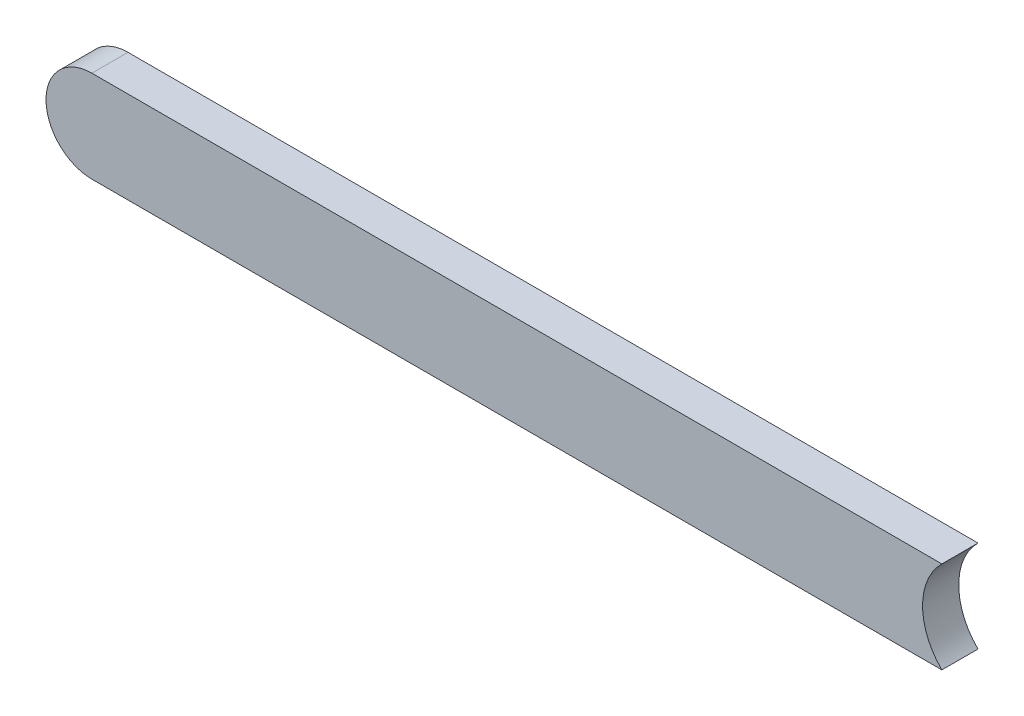
ISO-10303-21;
HEADER;
FILE_DESCRIPTION(('STEP AP214'),'2;1');
FILE_NAME('part.step','',(''),(''),'','','');
FILE_SCHEMA(('AUTOMOTIVE_DESIGN { 1 0 10303 214 1 1 1 1 }'));
ENDSEC;
DATA;
#1=APPLICATION_CONTEXT('core data for automotive mechanical design processes');
#2=APPLICATION_PROTOCOL_DEFINITION('international standard','automotive_design',2000,#1);
#3=PRODUCT_CONTEXT('',#1,'mechanical');
#4=PRODUCT('Part','Part','',(#3));
#5=PRODUCT_RELATED_PRODUCT_CATEGORY('part','',(#4));
#6=PRODUCT_DEFINITION_FORMATION('','',#4);
#7=PRODUCT_DEFINITION_CONTEXT('part definition',#1,'design');
#8=PRODUCT_DEFINITION('design','',#6,#7);
#9=PRODUCT_DEFINITION_SHAPE('','',#8);
#10=(LENGTH_UNIT() NAMED_UNIT(*) SI_UNIT(.MILLI.,.METRE.));
#11=(NAMED_UNIT(*) PLANE_ANGLE_UNIT() SI_UNIT($,.RADIAN.));
#12=(NAMED_UNIT(*) SI_UNIT($,.STERADIAN.) SOLID_ANGLE_UNIT());
#13=UNCERTAINTY_MEASURE_WITH_UNIT(LENGTH_MEASURE(1.E-05),#10,'distance_accuracy_value','');
#14=(GEOMETRIC_REPRESENTATION_CONTEXT(3) GLOBAL_UNCERTAINTY_ASSIGNED_CONTEXT((#13)) GLOBAL_UNIT_ASSIGNED_CONTEXT((#10,
#11,#12)) REPRESENTATION_CONTEXT('',''));
#15=CARTESIAN_POINT('',(0.,0.,0.));
#16=DIRECTION('',(0.,0.,1.));
#17=DIRECTION('',(1.,0.,0.));
#18=AXIS2_PLACEMENT_3D('',#15,#16,#17);
#19=CARTESIAN_POINT('',(119.126,116.205,0.));
#20=DIRECTION('',(0.,1.,0.));
#21=DIRECTION('',(1.,0.,0.));
#22=AXIS2_PLACEMENT_3D('',#19,#20,#21);
#23=PLANE('',#22);
#24=DIRECTION('',(1.,0.,0.));
#25=VECTOR('',#24,1.);
#26=CARTESIAN_POINT('',(119.126,116.205,0.1999996));
#27=LINE('',#26,#25);
#28=CARTESIAN_POINT('',(119.126,116.205,0.1999996));
#29=VERTEX_POINT('',#28);
#30=CARTESIAN_POINT('',(123.830131842133,116.205,0.1999996));
#31=VERTEX_POINT('',#30);
#32=EDGE_CURVE('E11',#29,#31,#27,.T.);
#33=ORIENTED_EDGE('',*,*,#32,.F.);
#34=DIRECTION('',(0.,0.,1.));
#35=VECTOR('',#34,1.);
#36=CARTESIAN_POINT('',(119.126,116.205,0.));
#37=LINE('',#36,#35);
#38=CARTESIAN_POINT('',(119.126,116.205,0.));
#39=VERTEX_POINT('',#38);
#40=EDGE_CURVE('E24',#39,#29,#37,.T.);
#41=ORIENTED_EDGE('',*,*,#40,.F.);
#42=DIRECTION('',(1.,0.,0.));
#43=VECTOR('',#42,1.);
#44=CARTESIAN_POINT('',(119.126,116.205,0.));
#45=LINE('',#44,#43);
#46=CARTESIAN_POINT('',(123.830131842133,116.205,0.));
#47=VERTEX_POINT('',#46);
#48=EDGE_CURVE('E75',#39,#47,#45,.T.);
#49=ORIENTED_EDGE('',*,*,#48,.T.);
#50=DIRECTION('',(0.,0.,1.));
#51=VECTOR('',#50,1.);
#52=CARTESIAN_POINT('',(123.830131842133,116.205,0.));
#53=LINE('',#52,#51);
#54=EDGE_CURVE('E37',#47,#31,#53,.T.);
#55=ORIENTED_EDGE('',*,*,#54,.T.);
#56=EDGE_LOOP('',(#33,#41,#49,#55));
#57=FACE_BOUND('',#56,.T.);
#58=ADVANCED_FACE('F17',(#57),#23,.F.);
#59=CARTESIAN_POINT('',(124.079,116.459,0.));
#60=DIRECTION('',(0.,0.,-1.));
#61=DIRECTION('',(1.,0.,0.));
#62=AXIS2_PLACEMENT_3D('',#59,#60,#61);
#63=CYLINDRICAL_SURFACE('',#62,0.3556);
#64=DIRECTION('',(0.,0.,1.));
#65=VECTOR('',#64,1.);
#66=CARTESIAN_POINT('',(123.830131842133,116.713,0.));
#67=LINE('',#66,#65);
#68=CARTESIAN_POINT('',(123.830131842133,116.713,0.));
#69=VERTEX_POINT('',#68);
#70=CARTESIAN_POINT('',(123.830131842133,116.713,0.1999996));
#71=VERTEX_POINT('',#70);
#72=EDGE_CURVE('E67',#69,#71,#67,.T.);
#73=ORIENTED_EDGE('',*,*,#72,.T.);
#74=CARTESIAN_POINT('',(124.079,116.459,0.1999996));
#75=DIRECTION('',(0.,0.,1.));
#76=DIRECTION('',(1.,0.,0.));
#77=AXIS2_PLACEMENT_3D('',#74,#75,#76);
#78=CIRCLE('',#77,0.3556);
#79=EDGE_CURVE('E82',#71,#31,#78,.T.);
#80=ORIENTED_EDGE('',*,*,#79,.T.);
#81=ORIENTED_EDGE('',*,*,#54,.F.);
#82=CARTESIAN_POINT('',(124.079,116.459,0.));
#83=DIRECTION('',(0.,0.,1.));
#84=DIRECTION('',(1.,0.,0.));
#85=AXIS2_PLACEMENT_3D('',#82,#83,#84);
#86=CIRCLE('',#85,0.3556);
#87=EDGE_CURVE('E80',#69,#47,#86,.T.);
#88=ORIENTED_EDGE('',*,*,#87,.F.);
#89=EDGE_LOOP('',(#73,#80,#81,#88));
#90=FACE_BOUND('',#89,.T.);
#91=ADVANCED_FACE('F88',(#90),#63,.F.);
#92=CARTESIAN_POINT('',(123.830131842133,116.713,0.));
#93=DIRECTION('',(0.,-1.,0.));
#94=DIRECTION('',(-1.,0.,0.));
#95=AXIS2_PLACEMENT_3D('',#92,#93,#94);
#96=PLANE('',#95);
#97=DIRECTION('',(-1.,0.,0.));
#98=VECTOR('',#97,1.);
#99=CARTESIAN_POINT('',(124.079,116.713,0.1999996));
#100=LINE('',#99,#98);
#101=CARTESIAN_POINT('',(119.126,116.713,0.1999996));
#102=VERTEX_POINT('',#101);
#103=EDGE_CURVE('E71',#71,#102,#100,.T.);
#104=ORIENTED_EDGE('',*,*,#103,.F.);
#105=ORIENTED_EDGE('',*,*,#72,.F.);
#106=DIRECTION('',(-1.,0.,0.));
#107=VECTOR('',#106,1.);
#108=CARTESIAN_POINT('',(124.079,116.713,0.));
#109=LINE('',#108,#107);
#110=CARTESIAN_POINT('',(119.126,116.713,0.));
#111=VERTEX_POINT('',#110);
#112=EDGE_CURVE('E63',#69,#111,#109,.T.);
#113=ORIENTED_EDGE('',*,*,#112,.T.);
#114=DIRECTION('',(0.,0.,1.));
#115=VECTOR('',#114,1.);
#116=CARTESIAN_POINT('',(119.126,116.713,0.));
#117=LINE('',#116,#115);
#118=EDGE_CURVE('E53',#111,#102,#117,.T.);
#119=ORIENTED_EDGE('',*,*,#118,.T.);
#120=EDGE_LOOP('',(#104,#105,#113,#119));
#121=FACE_BOUND('',#120,.T.);
#122=ADVANCED_FACE('F66',(#121),#96,.F.);
#123=CARTESIAN_POINT('',(119.126,116.459,0.));
#124=DIRECTION('',(0.,0.,-1.));
#125=DIRECTION('',(0.,1.,0.));
#126=AXIS2_PLACEMENT_3D('',#123,#124,#125);
#127=CYLINDRICAL_SURFACE('',#126,0.253999999999995);
#128=CARTESIAN_POINT('',(119.126,116.459,0.1999996));
#129=DIRECTION('',(0.,0.,1.));
#130=DIRECTION('',(0.,1.,0.));
#131=AXIS2_PLACEMENT_3D('',#128,#129,#130);
#132=CIRCLE('',#131,0.253999999999995);
#133=EDGE_CURVE('E59',#102,#29,#132,.T.);
#134=ORIENTED_EDGE('',*,*,#133,.F.);
#135=ORIENTED_EDGE('',*,*,#118,.F.);
#136=CARTESIAN_POINT('',(119.126,116.459,0.));
#137=DIRECTION('',(0.,0.,1.));
#138=DIRECTION('',(0.,1.,0.));
#139=AXIS2_PLACEMENT_3D('',#136,#137,#138);
#140=CIRCLE('',#139,0.253999999999995);
#141=EDGE_CURVE('E57',#111,#39,#140,.T.);
#142=ORIENTED_EDGE('',*,*,#141,.T.);
#143=ORIENTED_EDGE('',*,*,#40,.T.);
#144=EDGE_LOOP('',(#134,#135,#142,#143));
#145=FACE_BOUND('',#144,.T.);
#146=ADVANCED_FACE('F55',(#145),#127,.T.);
#147=CARTESIAN_POINT('',(119.126,116.205,0.));
#148=DIRECTION('',(0.,0.,-1.));
#149=DIRECTION('',(-1.,0.,0.));
#150=AXIS2_PLACEMENT_3D('',#147,#148,#149);
#151=PLANE('',#150);
#152=ORIENTED_EDGE('',*,*,#48,.F.);
#153=ORIENTED_EDGE('',*,*,#141,.F.);
#154=ORIENTED_EDGE('',*,*,#112,.F.);
#155=ORIENTED_EDGE('',*,*,#87,.T.);
#156=EDGE_LOOP('',(#152,#153,#154,#155));
#157=FACE_BOUND('',#156,.T.);
#158=ADVANCED_FACE('F74',(#157),#151,.T.);
#159=CARTESIAN_POINT('',(119.126,116.205,0.1999996));
#160=DIRECTION('',(0.,0.,-1.));
#161=DIRECTION('',(-1.,0.,0.));
#162=AXIS2_PLACEMENT_3D('',#159,#160,#161);
#163=PLANE('',#162);
#164=ORIENTED_EDGE('',*,*,#133,.T.);
#165=ORIENTED_EDGE('',*,*,#32,.T.);
#166=ORIENTED_EDGE('',*,*,#79,.F.);
#167=ORIENTED_EDGE('',*,*,#103,.T.);
#168=EDGE_LOOP('',(#164,#165,#166,#167));
#169=FACE_BOUND('',#168,.T.);
#170=ADVANCED_FACE('F91',(#169),#163,.F.);
#171=CLOSED_SHELL('',(#58,#91,#122,#146,#158,#170));
#172=MANIFOLD_SOLID_BREP('B1',#171);
#173=ADVANCED_BREP_SHAPE_REPRESENTATION('',(#18,#172),#14);
#174=SHAPE_DEFINITION_REPRESENTATION(#9,#173);
ENDSEC;
END-ISO-10303-21;
